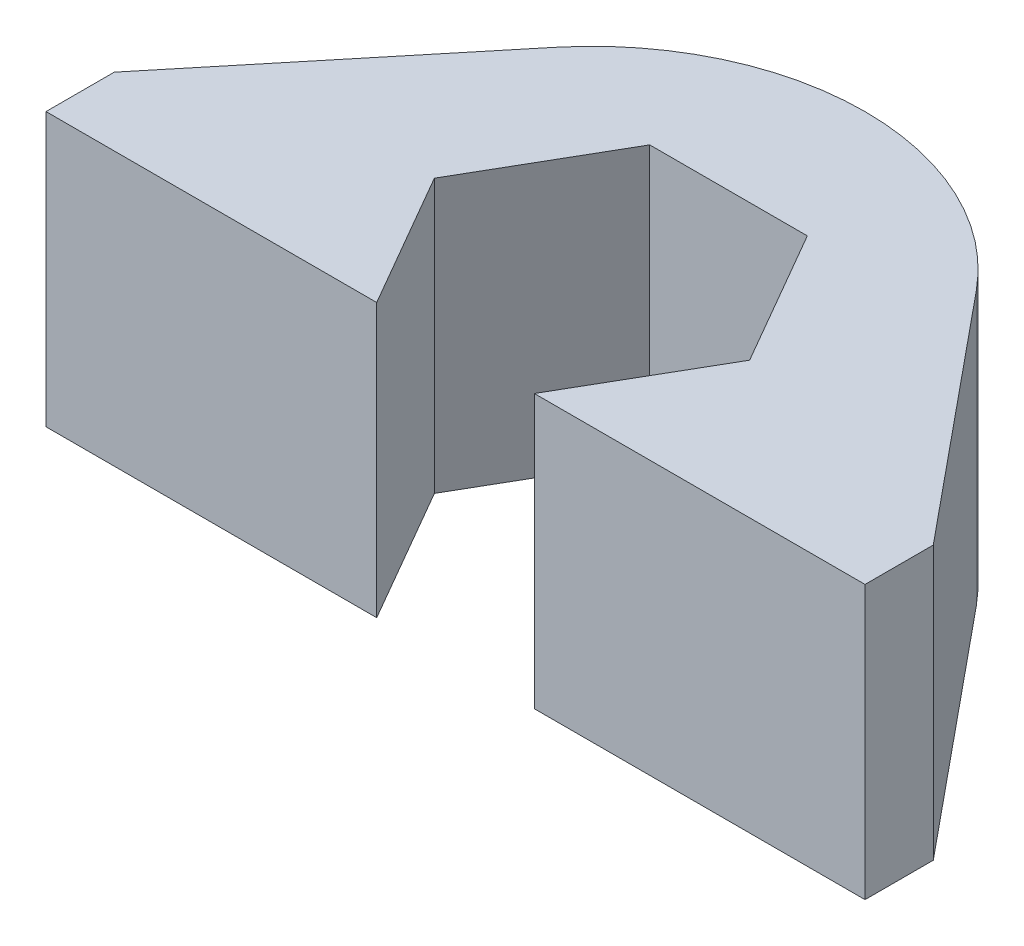
ISO-10303-21;
HEADER;
FILE_DESCRIPTION(('STEP AP214'),'2;1');
FILE_NAME('part.step','',(''),(''),'','','');
FILE_SCHEMA(('AUTOMOTIVE_DESIGN { 1 0 10303 214 1 1 1 1 }'));
ENDSEC;
DATA;
#1=APPLICATION_CONTEXT('core data for automotive mechanical design processes');
#2=APPLICATION_PROTOCOL_DEFINITION('international standard','automotive_design',2000,#1);
#3=PRODUCT_CONTEXT('',#1,'mechanical');
#4=PRODUCT('Part','Part','',(#3));
#5=PRODUCT_RELATED_PRODUCT_CATEGORY('part','',(#4));
#6=PRODUCT_DEFINITION_FORMATION('','',#4);
#7=PRODUCT_DEFINITION_CONTEXT('part definition',#1,'design');
#8=PRODUCT_DEFINITION('design','',#6,#7);
#9=PRODUCT_DEFINITION_SHAPE('','',#8);
#10=(LENGTH_UNIT() NAMED_UNIT(*) SI_UNIT(.MILLI.,.METRE.));
#11=(NAMED_UNIT(*) PLANE_ANGLE_UNIT() SI_UNIT($,.RADIAN.));
#12=(NAMED_UNIT(*) SI_UNIT($,.STERADIAN.) SOLID_ANGLE_UNIT());
#13=UNCERTAINTY_MEASURE_WITH_UNIT(LENGTH_MEASURE(1.E-05),#10,'distance_accuracy_value','');
#14=(GEOMETRIC_REPRESENTATION_CONTEXT(3) GLOBAL_UNCERTAINTY_ASSIGNED_CONTEXT((#13)) GLOBAL_UNIT_ASSIGNED_CONTEXT((#10,
#11,#12)) REPRESENTATION_CONTEXT('',''));
#15=CARTESIAN_POINT('',(0.,0.,0.));
#16=DIRECTION('',(0.,0.,1.));
#17=DIRECTION('',(1.,0.,0.));
#18=AXIS2_PLACEMENT_3D('',#15,#16,#17);
#19=CARTESIAN_POINT('',(9.81077598178211,12.7,-8.06465589069287));
#20=DIRECTION('',(-0.772502045809615,0.,0.635012274857707));
#21=DIRECTION('',(0.635012274857707,0.,0.772502045809615));
#22=AXIS2_PLACEMENT_3D('',#19,#20,#21);
#23=PLANE('',#22);
#24=DIRECTION('',(-0.635012274857707,0.,-0.772502045809615));
#25=VECTOR('',#24,1.);
#26=CARTESIAN_POINT('',(9.81077598178211,0.,-8.06465589069287));
#27=LINE('',#26,#25);
#28=CARTESIAN_POINT('',(19.0500000000001,0.,3.175));
#29=VERTEX_POINT('',#28);
#30=CARTESIAN_POINT('',(9.81077598178216,0.,-8.06465589069281));
#31=VERTEX_POINT('',#30);
#32=EDGE_CURVE('E213',#29,#31,#27,.T.);
#33=ORIENTED_EDGE('',*,*,#32,.T.);
#34=DIRECTION('',(0.,-1.,0.));
#35=VECTOR('',#34,1.);
#36=CARTESIAN_POINT('',(9.81077598178216,12.7,-8.06465589069281));
#37=LINE('',#36,#35);
#38=CARTESIAN_POINT('',(9.81077598178216,12.7,-8.06465589069281));
#39=VERTEX_POINT('',#38);
#40=EDGE_CURVE('E11',#39,#31,#37,.T.);
#41=ORIENTED_EDGE('',*,*,#40,.F.);
#42=DIRECTION('',(-0.635012274857707,0.,-0.772502045809615));
#43=VECTOR('',#42,1.);
#44=CARTESIAN_POINT('',(9.81077598178211,12.7,-8.06465589069287));
#45=LINE('',#44,#43);
#46=CARTESIAN_POINT('',(19.0500000000001,12.7,3.175));
#47=VERTEX_POINT('',#46);
#48=EDGE_CURVE('E176',#47,#39,#45,.T.);
#49=ORIENTED_EDGE('',*,*,#48,.F.);
#50=DIRECTION('',(0.,-1.,0.));
#51=VECTOR('',#50,1.);
#52=CARTESIAN_POINT('',(19.0500000000001,12.7,3.175));
#53=LINE('',#52,#51);
#54=EDGE_CURVE('E157',#47,#29,#53,.T.);
#55=ORIENTED_EDGE('',*,*,#54,.T.);
#56=EDGE_LOOP('',(#33,#41,#49,#55));
#57=FACE_BOUND('',#56,.T.);
#58=ADVANCED_FACE('F41',(#57),#23,.F.);
#59=CARTESIAN_POINT('',(0.,12.7,0.));
#60=DIRECTION('',(0.,-1.,0.));
#61=DIRECTION('',(0.,0.,-1.));
#62=AXIS2_PLACEMENT_3D('',#59,#60,#61);
#63=CYLINDRICAL_SURFACE('',#62,12.7);
#64=CARTESIAN_POINT('',(0.,0.,0.));
#65=DIRECTION('',(0.,1.,0.));
#66=DIRECTION('',(0.,0.,1.));
#67=AXIS2_PLACEMENT_3D('',#64,#65,#66);
#68=CIRCLE('',#67,12.7);
#69=CARTESIAN_POINT('',(-9.81077598178217,0.,-8.0646558906928));
#70=VERTEX_POINT('',#69);
#71=EDGE_CURVE('E208',#31,#70,#68,.T.);
#72=ORIENTED_EDGE('',*,*,#71,.T.);
#73=DIRECTION('',(0.,-1.,0.));
#74=VECTOR('',#73,1.);
#75=CARTESIAN_POINT('',(-9.81077598178217,12.7,-8.0646558906928));
#76=LINE('',#75,#74);
#77=CARTESIAN_POINT('',(-9.81077598178217,12.7,-8.0646558906928));
#78=VERTEX_POINT('',#77);
#79=EDGE_CURVE('E49',#78,#70,#76,.T.);
#80=ORIENTED_EDGE('',*,*,#79,.F.);
#81=CARTESIAN_POINT('',(0.,12.7,0.));
#82=DIRECTION('',(0.,1.,0.));
#83=DIRECTION('',(0.,0.,1.));
#84=AXIS2_PLACEMENT_3D('',#81,#82,#83);
#85=CIRCLE('',#84,12.7);
#86=EDGE_CURVE('E108',#39,#78,#85,.T.);
#87=ORIENTED_EDGE('',*,*,#86,.F.);
#88=ORIENTED_EDGE('',*,*,#40,.T.);
#89=EDGE_LOOP('',(#72,#80,#87,#88));
#90=FACE_BOUND('',#89,.T.);
#91=ADVANCED_FACE('F209',(#90),#63,.T.);
#92=CARTESIAN_POINT('',(-9.81077598178212,12.7,-8.06465589069287));
#93=DIRECTION('',(-0.772502045809615,0.,-0.635012274857706));
#94=DIRECTION('',(-0.635012274857706,0.,0.772502045809616));
#95=AXIS2_PLACEMENT_3D('',#92,#93,#94);
#96=PLANE('',#95);
#97=DIRECTION('',(0.635012274857706,0.,-0.772502045809615));
#98=VECTOR('',#97,1.);
#99=CARTESIAN_POINT('',(-9.81077598178212,0.,-8.06465589069287));
#100=LINE('',#99,#98);
#101=CARTESIAN_POINT('',(-19.0500000000001,0.,3.17500000000001));
#102=VERTEX_POINT('',#101);
#103=EDGE_CURVE('E205',#102,#70,#100,.T.);
#104=ORIENTED_EDGE('',*,*,#103,.F.);
#105=DIRECTION('',(0.,-1.,0.));
#106=VECTOR('',#105,1.);
#107=CARTESIAN_POINT('',(-19.0500000000001,12.7,3.17500000000001));
#108=LINE('',#107,#106);
#109=CARTESIAN_POINT('',(-19.0500000000001,12.7,3.17500000000001));
#110=VERTEX_POINT('',#109);
#111=EDGE_CURVE('E199',#110,#102,#108,.T.);
#112=ORIENTED_EDGE('',*,*,#111,.F.);
#113=DIRECTION('',(0.635012274857706,0.,-0.772502045809615));
#114=VECTOR('',#113,1.);
#115=CARTESIAN_POINT('',(-9.81077598178212,12.7,-8.06465589069287));
#116=LINE('',#115,#114);
#117=EDGE_CURVE('E169',#110,#78,#116,.T.);
#118=ORIENTED_EDGE('',*,*,#117,.T.);
#119=ORIENTED_EDGE('',*,*,#79,.T.);
#120=EDGE_LOOP('',(#104,#112,#118,#119));
#121=FACE_BOUND('',#120,.T.);
#122=ADVANCED_FACE('F203',(#121),#96,.T.);
#123=CARTESIAN_POINT('',(-19.0500000000002,12.7,7.91033905045426E-13));
#124=DIRECTION('',(-1.,0.,0.));
#125=DIRECTION('',(0.,0.,1.));
#126=AXIS2_PLACEMENT_3D('',#123,#124,#125);
#127=PLANE('',#126);
#128=DIRECTION('',(0.,0.,-1.));
#129=VECTOR('',#128,1.);
#130=CARTESIAN_POINT('',(-19.0500000000002,0.,7.91033905045426E-13));
#131=LINE('',#130,#129);
#132=CARTESIAN_POINT('',(-19.0499999999999,0.,6.35000000000004));
#133=VERTEX_POINT('',#132);
#134=EDGE_CURVE('E218',#133,#102,#131,.T.);
#135=ORIENTED_EDGE('',*,*,#134,.F.);
#136=DIRECTION('',(0.,-1.,0.));
#137=VECTOR('',#136,1.);
#138=CARTESIAN_POINT('',(-19.0499999999999,12.7,6.35000000000004));
#139=LINE('',#138,#137);
#140=CARTESIAN_POINT('',(-19.0499999999999,12.7,6.35000000000004));
#141=VERTEX_POINT('',#140);
#142=EDGE_CURVE('E197',#141,#133,#139,.T.);
#143=ORIENTED_EDGE('',*,*,#142,.F.);
#144=DIRECTION('',(0.,0.,-1.));
#145=VECTOR('',#144,1.);
#146=CARTESIAN_POINT('',(-19.0500000000002,12.7,7.91033905045426E-13));
#147=LINE('',#146,#145);
#148=EDGE_CURVE('E163',#141,#110,#147,.T.);
#149=ORIENTED_EDGE('',*,*,#148,.T.);
#150=ORIENTED_EDGE('',*,*,#111,.T.);
#151=EDGE_LOOP('',(#135,#143,#149,#150));
#152=FACE_BOUND('',#151,.T.);
#153=ADVANCED_FACE('F267',(#152),#127,.T.);
#154=CARTESIAN_POINT('',(0.,12.7,6.35));
#155=DIRECTION('',(0.,0.,1.));
#156=DIRECTION('',(1.,0.,0.));
#157=AXIS2_PLACEMENT_3D('',#154,#155,#156);
#158=PLANE('',#157);
#159=DIRECTION('',(-1.,0.,0.));
#160=VECTOR('',#159,1.);
#161=CARTESIAN_POINT('',(0.,0.,6.35));
#162=LINE('',#161,#160);
#163=CARTESIAN_POINT('',(-3.66617420935408,0.,6.35000000000001));
#164=VERTEX_POINT('',#163);
#165=EDGE_CURVE('E182',#164,#133,#162,.T.);
#166=ORIENTED_EDGE('',*,*,#165,.F.);
#167=DIRECTION('',(0.,-1.,0.));
#168=VECTOR('',#167,1.);
#169=CARTESIAN_POINT('',(-3.66617420935408,12.7,6.35000000000001));
#170=LINE('',#169,#168);
#171=CARTESIAN_POINT('',(-3.66617420935408,12.7,6.35000000000001));
#172=VERTEX_POINT('',#171);
#173=EDGE_CURVE('E195',#172,#164,#170,.T.);
#174=ORIENTED_EDGE('',*,*,#173,.F.);
#175=DIRECTION('',(-1.,0.,0.));
#176=VECTOR('',#175,1.);
#177=CARTESIAN_POINT('',(0.,12.7,6.35));
#178=LINE('',#177,#176);
#179=EDGE_CURVE('E156',#172,#141,#178,.T.);
#180=ORIENTED_EDGE('',*,*,#179,.T.);
#181=ORIENTED_EDGE('',*,*,#142,.T.);
#182=EDGE_LOOP('',(#166,#174,#180,#181));
#183=FACE_BOUND('',#182,.T.);
#184=ADVANCED_FACE('F272',(#183),#158,.T.);
#185=CARTESIAN_POINT('',(-5.49926131403116,12.7,3.17500000000004));
#186=DIRECTION('',(0.866025403784435,0.,-0.500000000000007));
#187=DIRECTION('',(-0.500000000000007,0.,-0.866025403784435));
#188=AXIS2_PLACEMENT_3D('',#185,#186,#187);
#189=PLANE('',#188);
#190=DIRECTION('',(0.500000000000007,0.,0.866025403784435));
#191=VECTOR('',#190,1.);
#192=CARTESIAN_POINT('',(-5.49926131403116,0.,3.17500000000004));
#193=LINE('',#192,#191);
#194=CARTESIAN_POINT('',(-7.33234841870825,0.,0.));
#195=VERTEX_POINT('',#194);
#196=EDGE_CURVE('E223',#195,#164,#193,.T.);
#197=ORIENTED_EDGE('',*,*,#196,.F.);
#198=DIRECTION('',(0.,-1.,0.));
#199=VECTOR('',#198,1.);
#200=CARTESIAN_POINT('',(-7.33234841870825,12.7,0.));
#201=LINE('',#200,#199);
#202=CARTESIAN_POINT('',(-7.33234841870825,12.7,0.));
#203=VERTEX_POINT('',#202);
#204=EDGE_CURVE('E193',#203,#195,#201,.T.);
#205=ORIENTED_EDGE('',*,*,#204,.F.);
#206=DIRECTION('',(0.500000000000007,0.,0.866025403784435));
#207=VECTOR('',#206,1.);
#208=CARTESIAN_POINT('',(-5.49926131403116,12.7,3.17500000000004));
#209=LINE('',#208,#207);
#210=EDGE_CURVE('E162',#203,#172,#209,.T.);
#211=ORIENTED_EDGE('',*,*,#210,.T.);
#212=ORIENTED_EDGE('',*,*,#173,.T.);
#213=EDGE_LOOP('',(#197,#205,#211,#212));
#214=FACE_BOUND('',#213,.T.);
#215=ADVANCED_FACE('F273',(#214),#189,.T.);
#216=CARTESIAN_POINT('',(-5.4992613140312,12.7,-3.17499999999997));
#217=DIRECTION('',(0.866025403784442,0.,0.499999999999995));
#218=DIRECTION('',(0.499999999999995,0.,-0.866025403784442));
#219=AXIS2_PLACEMENT_3D('',#216,#217,#218);
#220=PLANE('',#219);
#221=DIRECTION('',(-0.499999999999995,0.,0.866025403784442));
#222=VECTOR('',#221,1.);
#223=CARTESIAN_POINT('',(-5.4992613140312,0.,-3.17499999999997));
#224=LINE('',#223,#222);
#225=CARTESIAN_POINT('',(-3.66617420935416,0.,-6.34999999999999));
#226=VERTEX_POINT('',#225);
#227=EDGE_CURVE('E226',#226,#195,#224,.T.);
#228=ORIENTED_EDGE('',*,*,#227,.F.);
#229=DIRECTION('',(0.,-1.,0.));
#230=VECTOR('',#229,1.);
#231=CARTESIAN_POINT('',(-3.66617420935416,12.7,-6.34999999999999));
#232=LINE('',#231,#230);
#233=CARTESIAN_POINT('',(-3.66617420935416,12.7,-6.34999999999999));
#234=VERTEX_POINT('',#233);
#235=EDGE_CURVE('E191',#234,#226,#232,.T.);
#236=ORIENTED_EDGE('',*,*,#235,.F.);
#237=DIRECTION('',(-0.499999999999995,0.,0.866025403784442));
#238=VECTOR('',#237,1.);
#239=CARTESIAN_POINT('',(-5.4992613140312,12.7,-3.17499999999997));
#240=LINE('',#239,#238);
#241=EDGE_CURVE('E167',#234,#203,#240,.T.);
#242=ORIENTED_EDGE('',*,*,#241,.T.);
#243=ORIENTED_EDGE('',*,*,#204,.T.);
#244=EDGE_LOOP('',(#228,#236,#242,#243));
#245=FACE_BOUND('',#244,.T.);
#246=ADVANCED_FACE('F244',(#245),#220,.T.);
#247=CARTESIAN_POINT('',(0.,12.7,-6.35));
#248=DIRECTION('',(0.,0.,1.));
#249=DIRECTION('',(1.,0.,0.));
#250=AXIS2_PLACEMENT_3D('',#247,#248,#249);
#251=PLANE('',#250);
#252=DIRECTION('',(-1.,0.,0.));
#253=VECTOR('',#252,1.);
#254=CARTESIAN_POINT('',(0.,0.,-6.35));
#255=LINE('',#254,#253);
#256=CARTESIAN_POINT('',(3.66617420935411,0.,-6.35000000000001));
#257=VERTEX_POINT('',#256);
#258=EDGE_CURVE('E229',#257,#226,#255,.T.);
#259=ORIENTED_EDGE('',*,*,#258,.F.);
#260=DIRECTION('',(0.,-1.,0.));
#261=VECTOR('',#260,1.);
#262=CARTESIAN_POINT('',(3.66617420935411,12.7,-6.35000000000001));
#263=LINE('',#262,#261);
#264=CARTESIAN_POINT('',(3.66617420935411,12.7,-6.35000000000001));
#265=VERTEX_POINT('',#264);
#266=EDGE_CURVE('E189',#265,#257,#263,.T.);
#267=ORIENTED_EDGE('',*,*,#266,.F.);
#268=DIRECTION('',(-1.,0.,0.));
#269=VECTOR('',#268,1.);
#270=CARTESIAN_POINT('',(0.,12.7,-6.35));
#271=LINE('',#270,#269);
#272=EDGE_CURVE('E237',#265,#234,#271,.T.);
#273=ORIENTED_EDGE('',*,*,#272,.T.);
#274=ORIENTED_EDGE('',*,*,#235,.T.);
#275=EDGE_LOOP('',(#259,#267,#273,#274));
#276=FACE_BOUND('',#275,.T.);
#277=ADVANCED_FACE('F249',(#276),#251,.T.);
#278=CARTESIAN_POINT('',(5.49926131403118,12.7,-3.17500000000001));
#279=DIRECTION('',(-0.866025403784438,0.,0.500000000000001));
#280=DIRECTION('',(0.500000000000001,0.,0.866025403784438));
#281=AXIS2_PLACEMENT_3D('',#278,#279,#280);
#282=PLANE('',#281);
#283=DIRECTION('',(-0.500000000000001,0.,-0.866025403784438));
#284=VECTOR('',#283,1.);
#285=CARTESIAN_POINT('',(5.49926131403118,0.,-3.17500000000001));
#286=LINE('',#285,#284);
#287=CARTESIAN_POINT('',(7.33234841870825,0.,0.));
#288=VERTEX_POINT('',#287);
#289=EDGE_CURVE('E231',#288,#257,#286,.T.);
#290=ORIENTED_EDGE('',*,*,#289,.F.);
#291=DIRECTION('',(0.,-1.,0.));
#292=VECTOR('',#291,1.);
#293=CARTESIAN_POINT('',(7.33234841870825,12.7,0.));
#294=LINE('',#293,#292);
#295=CARTESIAN_POINT('',(7.33234841870825,12.7,0.));
#296=VERTEX_POINT('',#295);
#297=EDGE_CURVE('E145',#296,#288,#294,.T.);
#298=ORIENTED_EDGE('',*,*,#297,.F.);
#299=DIRECTION('',(-0.500000000000001,0.,-0.866025403784438));
#300=VECTOR('',#299,1.);
#301=CARTESIAN_POINT('',(5.49926131403118,12.7,-3.17500000000001));
#302=LINE('',#301,#300);
#303=EDGE_CURVE('E152',#296,#265,#302,.T.);
#304=ORIENTED_EDGE('',*,*,#303,.T.);
#305=ORIENTED_EDGE('',*,*,#266,.T.);
#306=EDGE_LOOP('',(#290,#298,#304,#305));
#307=FACE_BOUND('',#306,.T.);
#308=ADVANCED_FACE('F251',(#307),#282,.T.);
#309=CARTESIAN_POINT('',(5.49926131403122,12.7,3.17499999999998));
#310=DIRECTION('',(-0.866025403784441,0.,-0.499999999999995));
#311=DIRECTION('',(-0.499999999999995,0.,0.866025403784441));
#312=AXIS2_PLACEMENT_3D('',#309,#310,#311);
#313=PLANE('',#312);
#314=DIRECTION('',(0.499999999999995,0.,-0.866025403784441));
#315=VECTOR('',#314,1.);
#316=CARTESIAN_POINT('',(5.49926131403122,0.,3.17499999999998));
#317=LINE('',#316,#315);
#318=CARTESIAN_POINT('',(3.6661742093542,0.,6.34999999999999));
#319=VERTEX_POINT('',#318);
#320=EDGE_CURVE('E140',#319,#288,#317,.T.);
#321=ORIENTED_EDGE('',*,*,#320,.F.);
#322=DIRECTION('',(0.,-1.,0.));
#323=VECTOR('',#322,1.);
#324=CARTESIAN_POINT('',(3.6661742093542,12.7,6.34999999999999));
#325=LINE('',#324,#323);
#326=CARTESIAN_POINT('',(3.6661742093542,12.7,6.34999999999999));
#327=VERTEX_POINT('',#326);
#328=EDGE_CURVE('E135',#327,#319,#325,.T.);
#329=ORIENTED_EDGE('',*,*,#328,.F.);
#330=DIRECTION('',(0.499999999999995,0.,-0.866025403784441));
#331=VECTOR('',#330,1.);
#332=CARTESIAN_POINT('',(5.49926131403122,12.7,3.17499999999998));
#333=LINE('',#332,#331);
#334=EDGE_CURVE('E138',#327,#296,#333,.T.);
#335=ORIENTED_EDGE('',*,*,#334,.T.);
#336=ORIENTED_EDGE('',*,*,#297,.T.);
#337=EDGE_LOOP('',(#321,#329,#335,#336));
#338=FACE_BOUND('',#337,.T.);
#339=ADVANCED_FACE('F137',(#338),#313,.T.);
#340=CARTESIAN_POINT('',(19.0500000000001,0.,6.34999999999996));
#341=VERTEX_POINT('',#340);
#342=EDGE_CURVE('E179',#341,#319,#162,.T.);
#343=ORIENTED_EDGE('',*,*,#342,.F.);
#344=DIRECTION('',(0.,-1.,0.));
#345=VECTOR('',#344,1.);
#346=CARTESIAN_POINT('',(19.0500000000001,12.7,6.34999999999996));
#347=LINE('',#346,#345);
#348=CARTESIAN_POINT('',(19.0500000000001,12.7,6.34999999999996));
#349=VERTEX_POINT('',#348);
#350=EDGE_CURVE('E97',#349,#341,#347,.T.);
#351=ORIENTED_EDGE('',*,*,#350,.F.);
#352=EDGE_CURVE('E149',#349,#327,#178,.T.);
#353=ORIENTED_EDGE('',*,*,#352,.T.);
#354=ORIENTED_EDGE('',*,*,#328,.T.);
#355=EDGE_LOOP('',(#343,#351,#353,#354));
#356=FACE_BOUND('',#355,.T.);
#357=ADVANCED_FACE('F154',(#356),#158,.T.);
#358=CARTESIAN_POINT('',(19.0500000000001,12.7,0.));
#359=DIRECTION('',(-1.,0.,0.));
#360=DIRECTION('',(0.,0.,1.));
#361=AXIS2_PLACEMENT_3D('',#358,#359,#360);
#362=PLANE('',#361);
#363=DIRECTION('',(0.,0.,-1.));
#364=VECTOR('',#363,1.);
#365=CARTESIAN_POINT('',(19.0500000000001,0.,0.));
#366=LINE('',#365,#364);
#367=EDGE_CURVE('E100',#341,#29,#366,.T.);
#368=ORIENTED_EDGE('',*,*,#367,.T.);
#369=ORIENTED_EDGE('',*,*,#54,.F.);
#370=DIRECTION('',(0.,0.,-1.));
#371=VECTOR('',#370,1.);
#372=CARTESIAN_POINT('',(19.0500000000001,12.7,0.));
#373=LINE('',#372,#371);
#374=EDGE_CURVE('E57',#349,#47,#373,.T.);
#375=ORIENTED_EDGE('',*,*,#374,.F.);
#376=ORIENTED_EDGE('',*,*,#350,.T.);
#377=EDGE_LOOP('',(#368,#369,#375,#376));
#378=FACE_BOUND('',#377,.T.);
#379=ADVANCED_FACE('F308',(#378),#362,.F.);
#380=CARTESIAN_POINT('',(0.,12.7,0.));
#381=DIRECTION('',(0.,1.,0.));
#382=DIRECTION('',(0.,0.,1.));
#383=AXIS2_PLACEMENT_3D('',#380,#381,#382);
#384=PLANE('',#383);
#385=ORIENTED_EDGE('',*,*,#48,.T.);
#386=ORIENTED_EDGE('',*,*,#86,.T.);
#387=ORIENTED_EDGE('',*,*,#117,.F.);
#388=ORIENTED_EDGE('',*,*,#148,.F.);
#389=ORIENTED_EDGE('',*,*,#179,.F.);
#390=ORIENTED_EDGE('',*,*,#210,.F.);
#391=ORIENTED_EDGE('',*,*,#241,.F.);
#392=ORIENTED_EDGE('',*,*,#272,.F.);
#393=ORIENTED_EDGE('',*,*,#303,.F.);
#394=ORIENTED_EDGE('',*,*,#334,.F.);
#395=ORIENTED_EDGE('',*,*,#352,.F.);
#396=ORIENTED_EDGE('',*,*,#374,.T.);
#397=EDGE_LOOP('',(#385,#386,#387,#388,#389,#390,#391,#392,#393,#394,#395,#396));
#398=FACE_BOUND('',#397,.T.);
#399=ADVANCED_FACE('F148',(#398),#384,.T.);
#400=CARTESIAN_POINT('',(0.,0.,0.));
#401=DIRECTION('',(0.,1.,0.));
#402=DIRECTION('',(0.,0.,1.));
#403=AXIS2_PLACEMENT_3D('',#400,#401,#402);
#404=PLANE('',#403);
#405=ORIENTED_EDGE('',*,*,#32,.F.);
#406=ORIENTED_EDGE('',*,*,#367,.F.);
#407=ORIENTED_EDGE('',*,*,#342,.T.);
#408=ORIENTED_EDGE('',*,*,#320,.T.);
#409=ORIENTED_EDGE('',*,*,#289,.T.);
#410=ORIENTED_EDGE('',*,*,#258,.T.);
#411=ORIENTED_EDGE('',*,*,#227,.T.);
#412=ORIENTED_EDGE('',*,*,#196,.T.);
#413=ORIENTED_EDGE('',*,*,#165,.T.);
#414=ORIENTED_EDGE('',*,*,#134,.T.);
#415=ORIENTED_EDGE('',*,*,#103,.T.);
#416=ORIENTED_EDGE('',*,*,#71,.F.);
#417=EDGE_LOOP('',(#405,#406,#407,#408,#409,#410,#411,#412,#413,#414,#415,#416));
#418=FACE_BOUND('',#417,.T.);
#419=ADVANCED_FACE('F215',(#418),#404,.F.);
#420=CLOSED_SHELL('',(#58,#91,#122,#153,#184,#215,#246,#277,#308,#339,#357,#379,#399,#419));
#421=MANIFOLD_SOLID_BREP('B2',#420);
#422=ADVANCED_BREP_SHAPE_REPRESENTATION('',(#18,#421),#14);
#423=SHAPE_DEFINITION_REPRESENTATION(#9,#422);
ENDSEC;
END-ISO-10303-21;
